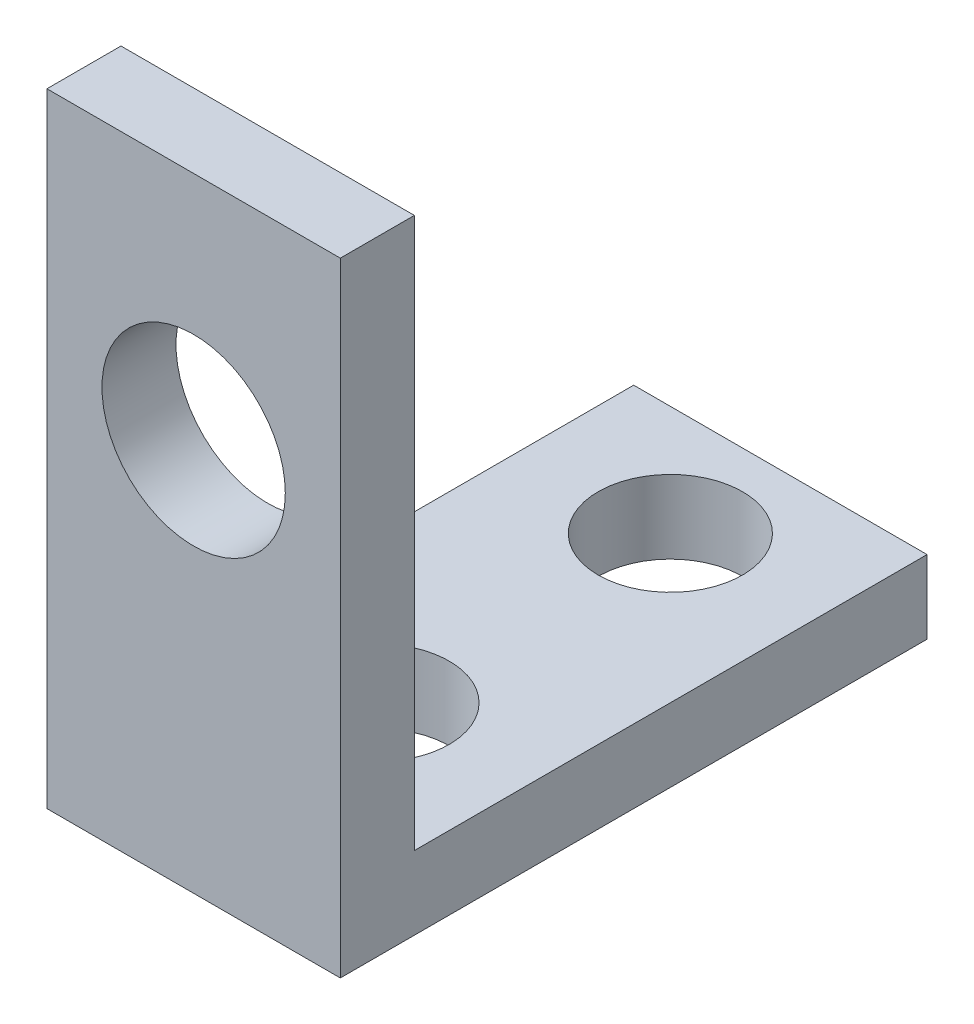
ISO-10303-21;
HEADER;
FILE_DESCRIPTION(('STEP AP214'),'2;1');
FILE_NAME('part.step','',(''),(''),'','','');
FILE_SCHEMA(('AUTOMOTIVE_DESIGN { 1 0 10303 214 1 1 1 1 }'));
ENDSEC;
DATA;
#1=APPLICATION_CONTEXT('core data for automotive mechanical design processes');
#2=APPLICATION_PROTOCOL_DEFINITION('international standard','automotive_design',2000,#1);
#3=PRODUCT_CONTEXT('',#1,'mechanical');
#4=PRODUCT('Part','Part','',(#3));
#5=PRODUCT_RELATED_PRODUCT_CATEGORY('part','',(#4));
#6=PRODUCT_DEFINITION_FORMATION('','',#4);
#7=PRODUCT_DEFINITION_CONTEXT('part definition',#1,'design');
#8=PRODUCT_DEFINITION('design','',#6,#7);
#9=PRODUCT_DEFINITION_SHAPE('','',#8);
#10=(LENGTH_UNIT() NAMED_UNIT(*) SI_UNIT(.MILLI.,.METRE.));
#11=(NAMED_UNIT(*) PLANE_ANGLE_UNIT() SI_UNIT($,.RADIAN.));
#12=(NAMED_UNIT(*) SI_UNIT($,.STERADIAN.) SOLID_ANGLE_UNIT());
#13=UNCERTAINTY_MEASURE_WITH_UNIT(LENGTH_MEASURE(1.E-05),#10,'distance_accuracy_value','');
#14=(GEOMETRIC_REPRESENTATION_CONTEXT(3) GLOBAL_UNCERTAINTY_ASSIGNED_CONTEXT((#13)) GLOBAL_UNIT_ASSIGNED_CONTEXT((#10,
#11,#12)) REPRESENTATION_CONTEXT('',''));
#15=CARTESIAN_POINT('',(0.,0.,0.));
#16=DIRECTION('',(0.,0.,1.));
#17=DIRECTION('',(1.,0.,0.));
#18=AXIS2_PLACEMENT_3D('',#15,#16,#17);
#19=CARTESIAN_POINT('',(0.,2.54,0.));
#20=DIRECTION('',(0.,-1.,0.));
#21=DIRECTION('',(0.,0.,-1.));
#22=AXIS2_PLACEMENT_3D('',#19,#20,#21);
#23=PLANE('',#22);
#24=CARTESIAN_POINT('',(0.,2.54,3.81));
#25=DIRECTION('',(0.,1.,0.));
#26=DIRECTION('',(0.,0.,1.));
#27=AXIS2_PLACEMENT_3D('',#24,#25,#26);
#28=CIRCLE('',#27,2.50063);
#29=CARTESIAN_POINT('',(0.,2.54,6.31063));
#30=VERTEX_POINT('',#29);
#31=EDGE_CURVE('E137',#30,#30,#28,.T.);
#32=ORIENTED_EDGE('',*,*,#31,.F.);
#33=EDGE_LOOP('',(#32));
#34=FACE_BOUND('',#33,.T.);
#35=CARTESIAN_POINT('',(0.,2.54,-6.35));
#36=DIRECTION('',(0.,1.,0.));
#37=DIRECTION('',(0.,0.,1.));
#38=AXIS2_PLACEMENT_3D('',#35,#36,#37);
#39=CIRCLE('',#38,2.50063);
#40=CARTESIAN_POINT('',(0.,2.54,-3.84937));
#41=VERTEX_POINT('',#40);
#42=EDGE_CURVE('E105',#41,#41,#39,.T.);
#43=ORIENTED_EDGE('',*,*,#42,.F.);
#44=EDGE_LOOP('',(#43));
#45=FACE_BOUND('',#44,.T.);
#46=DIRECTION('',(-1.,0.,0.));
#47=VECTOR('',#46,1.);
#48=CARTESIAN_POINT('',(-5.08,2.54,7.59580624885166));
#49=LINE('',#48,#47);
#50=CARTESIAN_POINT('',(5.08,2.54,7.59580624885166));
#51=VERTEX_POINT('',#50);
#52=CARTESIAN_POINT('',(-5.08,2.54,7.59580624885166));
#53=VERTEX_POINT('',#52);
#54=EDGE_CURVE('E51',#51,#53,#49,.T.);
#55=ORIENTED_EDGE('',*,*,#54,.F.);
#56=DIRECTION('',(0.,0.,-1.));
#57=VECTOR('',#56,1.);
#58=CARTESIAN_POINT('',(5.08,2.54,10.16));
#59=LINE('',#58,#57);
#60=CARTESIAN_POINT('',(5.08,2.54,-10.16));
#61=VERTEX_POINT('',#60);
#62=EDGE_CURVE('E89',#51,#61,#59,.T.);
#63=ORIENTED_EDGE('',*,*,#62,.T.);
#64=DIRECTION('',(-1.,0.,0.));
#65=VECTOR('',#64,1.);
#66=CARTESIAN_POINT('',(-5.08,2.54,-10.16));
#67=LINE('',#66,#65);
#68=CARTESIAN_POINT('',(-5.08,2.54,-10.16));
#69=VERTEX_POINT('',#68);
#70=EDGE_CURVE('E57',#61,#69,#67,.T.);
#71=ORIENTED_EDGE('',*,*,#70,.T.);
#72=DIRECTION('',(0.,0.,1.));
#73=VECTOR('',#72,1.);
#74=CARTESIAN_POINT('',(-5.08,2.54,10.16));
#75=LINE('',#74,#73);
#76=EDGE_CURVE('E100',#69,#53,#75,.T.);
#77=ORIENTED_EDGE('',*,*,#76,.T.);
#78=EDGE_LOOP('',(#55,#63,#71,#77));
#79=FACE_BOUND('',#78,.T.);
#80=ADVANCED_FACE('F36',(#34,#45,#79),#23,.F.);
#81=CARTESIAN_POINT('',(0.,0.,0.));
#82=DIRECTION('',(0.,-1.,0.));
#83=DIRECTION('',(0.,0.,-1.));
#84=AXIS2_PLACEMENT_3D('',#81,#82,#83);
#85=PLANE('',#84);
#86=CARTESIAN_POINT('',(0.,0.,-6.35));
#87=DIRECTION('',(0.,1.,0.));
#88=DIRECTION('',(0.,0.,1.));
#89=AXIS2_PLACEMENT_3D('',#86,#87,#88);
#90=CIRCLE('',#89,2.50063);
#91=CARTESIAN_POINT('',(0.,0.,-3.84937));
#92=VERTEX_POINT('',#91);
#93=EDGE_CURVE('E109',#92,#92,#90,.T.);
#94=ORIENTED_EDGE('',*,*,#93,.T.);
#95=EDGE_LOOP('',(#94));
#96=FACE_BOUND('',#95,.T.);
#97=DIRECTION('',(0.,0.,-1.));
#98=VECTOR('',#97,1.);
#99=CARTESIAN_POINT('',(5.08,0.,10.16));
#100=LINE('',#99,#98);
#101=CARTESIAN_POINT('',(5.08,0.,10.16));
#102=VERTEX_POINT('',#101);
#103=CARTESIAN_POINT('',(5.08,0.,-10.16));
#104=VERTEX_POINT('',#103);
#105=EDGE_CURVE('E96',#102,#104,#100,.T.);
#106=ORIENTED_EDGE('',*,*,#105,.F.);
#107=DIRECTION('',(1.,0.,0.));
#108=VECTOR('',#107,1.);
#109=CARTESIAN_POINT('',(-5.08,0.,10.16));
#110=LINE('',#109,#108);
#111=CARTESIAN_POINT('',(-5.08,0.,10.16));
#112=VERTEX_POINT('',#111);
#113=EDGE_CURVE('E77',#112,#102,#110,.T.);
#114=ORIENTED_EDGE('',*,*,#113,.F.);
#115=DIRECTION('',(0.,0.,1.));
#116=VECTOR('',#115,1.);
#117=CARTESIAN_POINT('',(-5.08,0.,10.16));
#118=LINE('',#117,#116);
#119=CARTESIAN_POINT('',(-5.08,0.,-10.16));
#120=VERTEX_POINT('',#119);
#121=EDGE_CURVE('E90',#120,#112,#118,.T.);
#122=ORIENTED_EDGE('',*,*,#121,.F.);
#123=DIRECTION('',(-1.,0.,0.));
#124=VECTOR('',#123,1.);
#125=CARTESIAN_POINT('',(-5.08,0.,-10.16));
#126=LINE('',#125,#124);
#127=EDGE_CURVE('E104',#104,#120,#126,.T.);
#128=ORIENTED_EDGE('',*,*,#127,.F.);
#129=EDGE_LOOP('',(#106,#114,#122,#128));
#130=FACE_BOUND('',#129,.T.);
#131=CARTESIAN_POINT('',(0.,0.,3.81));
#132=DIRECTION('',(0.,1.,0.));
#133=DIRECTION('',(0.,0.,1.));
#134=AXIS2_PLACEMENT_3D('',#131,#132,#133);
#135=CIRCLE('',#134,2.50063);
#136=CARTESIAN_POINT('',(0.,0.,6.31063));
#137=VERTEX_POINT('',#136);
#138=EDGE_CURVE('E133',#137,#137,#135,.T.);
#139=ORIENTED_EDGE('',*,*,#138,.T.);
#140=EDGE_LOOP('',(#139));
#141=FACE_BOUND('',#140,.T.);
#142=ADVANCED_FACE('F102',(#96,#130,#141),#85,.T.);
#143=CARTESIAN_POINT('',(5.08,2.54,10.16));
#144=DIRECTION('',(-1.,0.,0.));
#145=DIRECTION('',(0.,0.,1.));
#146=AXIS2_PLACEMENT_3D('',#143,#144,#145);
#147=PLANE('',#146);
#148=ORIENTED_EDGE('',*,*,#105,.T.);
#149=DIRECTION('',(0.,-1.,0.));
#150=VECTOR('',#149,1.);
#151=CARTESIAN_POINT('',(5.08,2.54,-10.16));
#152=LINE('',#151,#150);
#153=EDGE_CURVE('E11',#61,#104,#152,.T.);
#154=ORIENTED_EDGE('',*,*,#153,.F.);
#155=ORIENTED_EDGE('',*,*,#62,.F.);
#156=DIRECTION('',(0.,-1.,0.));
#157=VECTOR('',#156,1.);
#158=CARTESIAN_POINT('',(5.08,21.59,7.59580624885166));
#159=LINE('',#158,#157);
#160=CARTESIAN_POINT('',(5.08,21.59,7.59580624885166));
#161=VERTEX_POINT('',#160);
#162=EDGE_CURVE('E124',#161,#51,#159,.T.);
#163=ORIENTED_EDGE('',*,*,#162,.F.);
#164=DIRECTION('',(0.,0.,-1.));
#165=VECTOR('',#164,1.);
#166=CARTESIAN_POINT('',(5.08,21.59,10.16));
#167=LINE('',#166,#165);
#168=CARTESIAN_POINT('',(5.08,21.59,10.16));
#169=VERTEX_POINT('',#168);
#170=EDGE_CURVE('E99',#169,#161,#167,.T.);
#171=ORIENTED_EDGE('',*,*,#170,.F.);
#172=DIRECTION('',(0.,-1.,0.));
#173=VECTOR('',#172,1.);
#174=CARTESIAN_POINT('',(5.08,2.54,10.16));
#175=LINE('',#174,#173);
#176=EDGE_CURVE('E82',#169,#102,#175,.T.);
#177=ORIENTED_EDGE('',*,*,#176,.T.);
#178=EDGE_LOOP('',(#148,#154,#155,#163,#171,#177));
#179=FACE_BOUND('',#178,.T.);
#180=ADVANCED_FACE('F38',(#179),#147,.F.);
#181=CARTESIAN_POINT('',(-5.08,2.54,-10.16));
#182=DIRECTION('',(0.,0.,1.));
#183=DIRECTION('',(1.,0.,0.));
#184=AXIS2_PLACEMENT_3D('',#181,#182,#183);
#185=PLANE('',#184);
#186=ORIENTED_EDGE('',*,*,#127,.T.);
#187=DIRECTION('',(0.,-1.,0.));
#188=VECTOR('',#187,1.);
#189=CARTESIAN_POINT('',(-5.08,2.54,-10.16));
#190=LINE('',#189,#188);
#191=EDGE_CURVE('E44',#69,#120,#190,.T.);
#192=ORIENTED_EDGE('',*,*,#191,.F.);
#193=ORIENTED_EDGE('',*,*,#70,.F.);
#194=ORIENTED_EDGE('',*,*,#153,.T.);
#195=EDGE_LOOP('',(#186,#192,#193,#194));
#196=FACE_BOUND('',#195,.T.);
#197=ADVANCED_FACE('F121',(#196),#185,.F.);
#198=CARTESIAN_POINT('',(-5.08,2.54,10.16));
#199=DIRECTION('',(1.,0.,0.));
#200=DIRECTION('',(0.,0.,-1.));
#201=AXIS2_PLACEMENT_3D('',#198,#199,#200);
#202=PLANE('',#201);
#203=ORIENTED_EDGE('',*,*,#121,.T.);
#204=DIRECTION('',(0.,-1.,0.));
#205=VECTOR('',#204,1.);
#206=CARTESIAN_POINT('',(-5.08,2.54,10.16));
#207=LINE('',#206,#205);
#208=CARTESIAN_POINT('',(-5.08,21.59,10.16));
#209=VERTEX_POINT('',#208);
#210=EDGE_CURVE('E85',#209,#112,#207,.T.);
#211=ORIENTED_EDGE('',*,*,#210,.F.);
#212=DIRECTION('',(0.,0.,1.));
#213=VECTOR('',#212,1.);
#214=CARTESIAN_POINT('',(-5.08,21.59,10.16));
#215=LINE('',#214,#213);
#216=CARTESIAN_POINT('',(-5.08,21.59,7.59580624885166));
#217=VERTEX_POINT('',#216);
#218=EDGE_CURVE('E156',#217,#209,#215,.T.);
#219=ORIENTED_EDGE('',*,*,#218,.F.);
#220=DIRECTION('',(0.,-1.,0.));
#221=VECTOR('',#220,1.);
#222=CARTESIAN_POINT('',(-5.08,21.59,7.59580624885166));
#223=LINE('',#222,#221);
#224=EDGE_CURVE('E134',#217,#53,#223,.T.);
#225=ORIENTED_EDGE('',*,*,#224,.T.);
#226=ORIENTED_EDGE('',*,*,#76,.F.);
#227=ORIENTED_EDGE('',*,*,#191,.T.);
#228=EDGE_LOOP('',(#203,#211,#219,#225,#226,#227));
#229=FACE_BOUND('',#228,.T.);
#230=ADVANCED_FACE('F118',(#229),#202,.F.);
#231=CARTESIAN_POINT('',(-5.08,2.54,10.16));
#232=DIRECTION('',(0.,0.,-1.));
#233=DIRECTION('',(-1.,0.,0.));
#234=AXIS2_PLACEMENT_3D('',#231,#232,#233);
#235=PLANE('',#234);
#236=CARTESIAN_POINT('',(0.,13.589,10.16));
#237=DIRECTION('',(0.,0.,1.));
#238=DIRECTION('',(1.,0.,0.));
#239=AXIS2_PLACEMENT_3D('',#236,#237,#238);
#240=CIRCLE('',#239,3.175);
#241=CARTESIAN_POINT('',(3.175,13.589,10.16));
#242=VERTEX_POINT('',#241);
#243=EDGE_CURVE('E161',#242,#242,#240,.T.);
#244=ORIENTED_EDGE('',*,*,#243,.F.);
#245=EDGE_LOOP('',(#244));
#246=FACE_BOUND('',#245,.T.);
#247=ORIENTED_EDGE('',*,*,#113,.T.);
#248=ORIENTED_EDGE('',*,*,#176,.F.);
#249=DIRECTION('',(1.,0.,0.));
#250=VECTOR('',#249,1.);
#251=CARTESIAN_POINT('',(-5.08,21.59,10.16));
#252=LINE('',#251,#250);
#253=EDGE_CURVE('E153',#209,#169,#252,.T.);
#254=ORIENTED_EDGE('',*,*,#253,.F.);
#255=ORIENTED_EDGE('',*,*,#210,.T.);
#256=EDGE_LOOP('',(#247,#248,#254,#255));
#257=FACE_BOUND('',#256,.T.);
#258=ADVANCED_FACE('F79',(#246,#257),#235,.F.);
#259=CARTESIAN_POINT('',(0.,2.54,-6.35));
#260=DIRECTION('',(0.,-1.,0.));
#261=DIRECTION('',(0.,0.,-1.));
#262=AXIS2_PLACEMENT_3D('',#259,#260,#261);
#263=CYLINDRICAL_SURFACE('',#262,2.50063);
#264=ORIENTED_EDGE('',*,*,#42,.T.);
#265=EDGE_LOOP('',(#264));
#266=FACE_BOUND('',#265,.T.);
#267=ORIENTED_EDGE('',*,*,#93,.F.);
#268=EDGE_LOOP('',(#267));
#269=FACE_BOUND('',#268,.T.);
#270=ADVANCED_FACE('F172',(#266,#269),#263,.F.);
#271=CARTESIAN_POINT('',(0.,2.54,3.81));
#272=DIRECTION('',(0.,-1.,0.));
#273=DIRECTION('',(0.,0.,-1.));
#274=AXIS2_PLACEMENT_3D('',#271,#272,#273);
#275=CYLINDRICAL_SURFACE('',#274,2.50063);
#276=ORIENTED_EDGE('',*,*,#31,.T.);
#277=EDGE_LOOP('',(#276));
#278=FACE_BOUND('',#277,.T.);
#279=ORIENTED_EDGE('',*,*,#138,.F.);
#280=EDGE_LOOP('',(#279));
#281=FACE_BOUND('',#280,.T.);
#282=ADVANCED_FACE('F178',(#278,#281),#275,.F.);
#283=CARTESIAN_POINT('',(-5.08,21.59,7.59580624885166));
#284=DIRECTION('',(0.,0.,1.));
#285=DIRECTION('',(1.,0.,0.));
#286=AXIS2_PLACEMENT_3D('',#283,#284,#285);
#287=PLANE('',#286);
#288=CARTESIAN_POINT('',(0.,13.589,7.59580624885166));
#289=DIRECTION('',(0.,0.,1.));
#290=DIRECTION('',(1.,0.,0.));
#291=AXIS2_PLACEMENT_3D('',#288,#289,#290);
#292=CIRCLE('',#291,3.175);
#293=CARTESIAN_POINT('',(3.175,13.589,7.59580624885166));
#294=VERTEX_POINT('',#293);
#295=EDGE_CURVE('E159',#294,#294,#292,.F.);
#296=ORIENTED_EDGE('',*,*,#295,.F.);
#297=EDGE_LOOP('',(#296));
#298=FACE_BOUND('',#297,.T.);
#299=ORIENTED_EDGE('',*,*,#54,.T.);
#300=ORIENTED_EDGE('',*,*,#224,.F.);
#301=DIRECTION('',(-1.,0.,0.));
#302=VECTOR('',#301,1.);
#303=CARTESIAN_POINT('',(-5.08,21.59,7.59580624885166));
#304=LINE('',#303,#302);
#305=EDGE_CURVE('E132',#161,#217,#304,.T.);
#306=ORIENTED_EDGE('',*,*,#305,.F.);
#307=ORIENTED_EDGE('',*,*,#162,.T.);
#308=EDGE_LOOP('',(#299,#300,#306,#307));
#309=FACE_BOUND('',#308,.T.);
#310=ADVANCED_FACE('F128',(#298,#309),#287,.F.);
#311=CARTESIAN_POINT('',(0.,21.59,0.));
#312=DIRECTION('',(0.,-1.,0.));
#313=DIRECTION('',(0.,0.,-1.));
#314=AXIS2_PLACEMENT_3D('',#311,#312,#313);
#315=PLANE('',#314);
#316=ORIENTED_EDGE('',*,*,#218,.T.);
#317=ORIENTED_EDGE('',*,*,#253,.T.);
#318=ORIENTED_EDGE('',*,*,#170,.T.);
#319=ORIENTED_EDGE('',*,*,#305,.T.);
#320=EDGE_LOOP('',(#316,#317,#318,#319));
#321=FACE_BOUND('',#320,.T.);
#322=ADVANCED_FACE('F152',(#321),#315,.F.);
#323=CARTESIAN_POINT('',(0.,13.589,-1.38444987221749));
#324=DIRECTION('',(0.,0.,1.));
#325=DIRECTION('',(1.,0.,0.));
#326=AXIS2_PLACEMENT_3D('',#323,#324,#325);
#327=CYLINDRICAL_SURFACE('',#326,3.175);
#328=CARTESIAN_POINT('',(3.175,13.589,7.59580624885166));
#329=CARTESIAN_POINT('',(3.175,13.589,7.62251660042612));
#330=CARTESIAN_POINT('',(3.175,13.589,7.64922695200058));
#331=CARTESIAN_POINT('',(3.175,13.589,7.70264765514951));
#332=CARTESIAN_POINT('',(3.175,13.589,7.72935800672397));
#333=CARTESIAN_POINT('',(3.175,13.589,7.78277870987289));
#334=CARTESIAN_POINT('',(3.175,13.589,7.80948906144735));
#335=CARTESIAN_POINT('',(3.175,13.589,7.86290976459628));
#336=CARTESIAN_POINT('',(3.175,13.589,7.88962011617074));
#337=CARTESIAN_POINT('',(3.175,13.589,7.94304081931966));
#338=CARTESIAN_POINT('',(3.175,13.589,7.96975117089413));
#339=CARTESIAN_POINT('',(3.175,13.589,8.02317187404305));
#340=CARTESIAN_POINT('',(3.175,13.589,8.04988222561751));
#341=CARTESIAN_POINT('',(3.175,13.589,8.10330292876644));
#342=CARTESIAN_POINT('',(3.175,13.589,8.1300132803409));
#343=CARTESIAN_POINT('',(3.175,13.589,8.18343398348982));
#344=CARTESIAN_POINT('',(3.175,13.589,8.21014433506429));
#345=CARTESIAN_POINT('',(3.175,13.589,8.26356503821321));
#346=CARTESIAN_POINT('',(3.175,13.589,8.29027538978767));
#347=CARTESIAN_POINT('',(3.175,13.589,8.34369609293659));
#348=CARTESIAN_POINT('',(3.175,13.589,8.37040644451105));
#349=CARTESIAN_POINT('',(3.175,13.589,8.42382714765998));
#350=CARTESIAN_POINT('',(3.175,13.589,8.45053749923444));
#351=CARTESIAN_POINT('',(3.175,13.589,8.50395820238336));
#352=CARTESIAN_POINT('',(3.175,13.589,8.53066855395783));
#353=CARTESIAN_POINT('',(3.175,13.589,8.58408925710675));
#354=CARTESIAN_POINT('',(3.175,13.589,8.61079960868121));
#355=CARTESIAN_POINT('',(3.175,13.589,8.66422031183014));
#356=CARTESIAN_POINT('',(3.175,13.589,8.6909306634046));
#357=CARTESIAN_POINT('',(3.175,13.589,8.74435136655352));
#358=CARTESIAN_POINT('',(3.175,13.589,8.77106171812798));
#359=CARTESIAN_POINT('',(3.175,13.589,8.82448242127691));
#360=CARTESIAN_POINT('',(3.175,13.589,8.85119277285137));
#361=CARTESIAN_POINT('',(3.175,13.589,8.90461347600029));
#362=CARTESIAN_POINT('',(3.175,13.589,8.93132382757475));
#363=CARTESIAN_POINT('',(3.175,13.589,8.98474453072368));
#364=CARTESIAN_POINT('',(3.175,13.589,9.01145488229814));
#365=CARTESIAN_POINT('',(3.175,13.589,9.06487558544706));
#366=CARTESIAN_POINT('',(3.175,13.589,9.09158593702153));
#367=CARTESIAN_POINT('',(3.175,13.589,9.14500664017045));
#368=CARTESIAN_POINT('',(3.175,13.589,9.17171699174491));
#369=CARTESIAN_POINT('',(3.175,13.589,9.22513769489384));
#370=CARTESIAN_POINT('',(3.175,13.589,9.2518480464683));
#371=CARTESIAN_POINT('',(3.175,13.589,9.30526874961722));
#372=CARTESIAN_POINT('',(3.175,13.589,9.33197910119168));
#373=CARTESIAN_POINT('',(3.175,13.589,9.38539980434061));
#374=CARTESIAN_POINT('',(3.175,13.589,9.41211015591507));
#375=CARTESIAN_POINT('',(3.175,13.589,9.46553085906399));
#376=CARTESIAN_POINT('',(3.175,13.589,9.49224121063845));
#377=CARTESIAN_POINT('',(3.175,13.589,9.54566191378738));
#378=CARTESIAN_POINT('',(3.175,13.589,9.57237226536184));
#379=CARTESIAN_POINT('',(3.175,13.589,9.62579296851076));
#380=CARTESIAN_POINT('',(3.175,13.589,9.65250332008523));
#381=CARTESIAN_POINT('',(3.175,13.589,9.70592402323415));
#382=CARTESIAN_POINT('',(3.175,13.589,9.73263437480861));
#383=CARTESIAN_POINT('',(3.175,13.589,9.78605507795753));
#384=CARTESIAN_POINT('',(3.175,13.589,9.812765429532));
#385=CARTESIAN_POINT('',(3.175,13.589,9.86618613268092));
#386=CARTESIAN_POINT('',(3.175,13.589,9.89289648425538));
#387=CARTESIAN_POINT('',(3.175,13.589,9.94631718740431));
#388=CARTESIAN_POINT('',(3.175,13.589,9.97302753897877));
#389=CARTESIAN_POINT('',(3.175,13.589,10.0264482421277));
#390=CARTESIAN_POINT('',(3.175,13.589,10.0531585937022));
#391=CARTESIAN_POINT('',(3.175,13.589,10.1065792968511));
#392=CARTESIAN_POINT('',(3.175,13.589,10.1332896484255));
#393=CARTESIAN_POINT('',(3.175,13.589,10.16));
#394=B_SPLINE_CURVE_WITH_KNOTS('',3,(#328,#329,#330,#331,#332,#333,#334,#335,#336,#337,#338,
#339,#340,#341,#342,#343,#344,#345,#346,#347,#348,#349,#350,#351,#352,#353,#354,#355,#356,#357,
#358,#359,#360,#361,#362,#363,#364,#365,#366,#367,#368,#369,#370,#371,#372,#373,#374,#375,#376,
#377,#378,#379,#380,#381,#382,#383,#384,#385,#386,#387,#388,#389,#390,#391,#392,#393),
.UNSPECIFIED.,.F.,.F.,(4,2,2,2,2,2,2,2,2,2,2,2,2,2,2,2,2,2,2,2,2,2,2,2,2,2,2,2,2,2,2,2,4),(0.,
0.0801310547233862,0.160262109446771,0.240393164170157,0.320524218893543,0.400655273616927,
0.480786328340314,0.5609173830637,0.641048437787086,0.721179492510471,0.801310547233857,
0.881441601957243,0.961572656680627,1.04170371140401,1.1218347661274,1.20196582085078,
1.28209687557417,1.36222793029756,1.44235898502094,1.52249003974433,1.60262109446771,
1.6827521491911,1.76288320391448,1.84301425863787,1.92314531336125,2.00327636808464,
2.08340742280803,2.16353847753141,2.2436695322548,2.32380058697818,2.40393164170157,
2.48406269642495,2.56419375114834),.UNSPECIFIED.);
#395=EDGE_CURVE('BSEAM169',#294,#242,#394,.T.);
#396=ORIENTED_EDGE('',*,*,#295,.T.);
#397=ORIENTED_EDGE('',*,*,#243,.T.);
#398=ORIENTED_EDGE('',*,*,#395,.T.);
#399=ORIENTED_EDGE('',*,*,#395,.F.);
#400=EDGE_LOOP('',(#396,#398,#397,#399));
#401=FACE_BOUND('',#400,.T.);
#402=ADVANCED_FACE('F169',(#401),#327,.F.);
#403=CLOSED_SHELL('',(#80,#142,#180,#197,#230,#258,#270,#282,#310,#322,#402));
#404=MANIFOLD_SOLID_BREP('B2',#403);
#405=ADVANCED_BREP_SHAPE_REPRESENTATION('',(#18,#404),#14);
#406=SHAPE_DEFINITION_REPRESENTATION(#9,#405);
ENDSEC;
END-ISO-10303-21;
